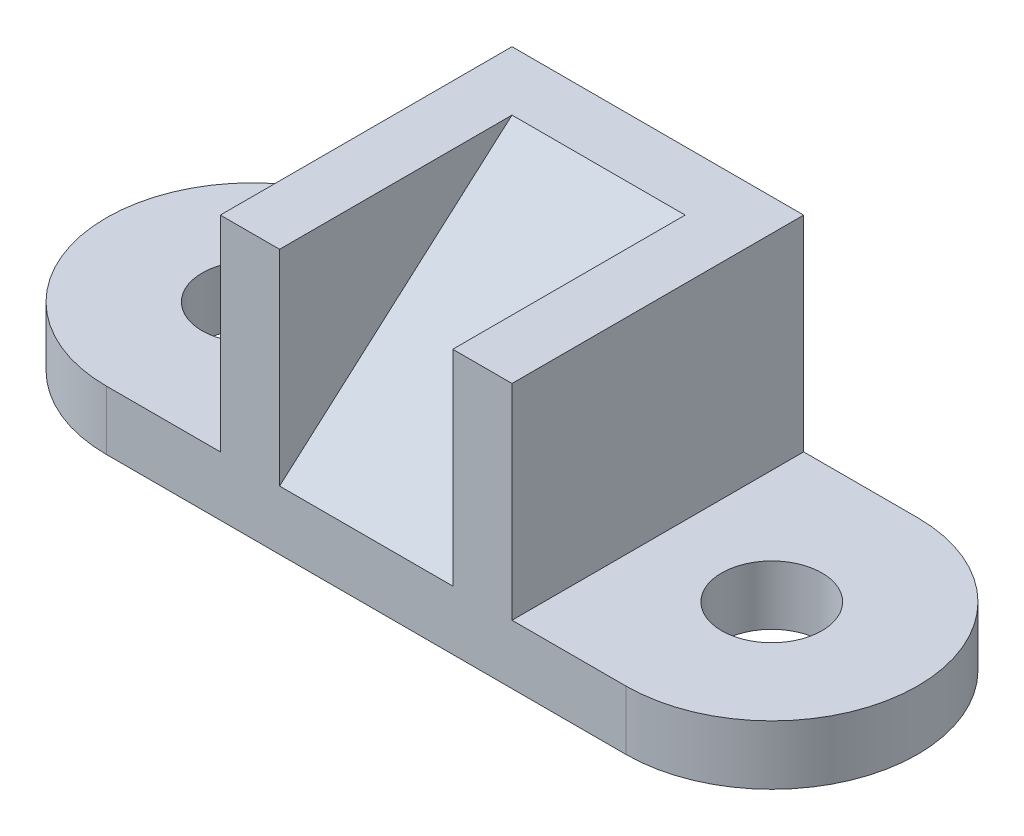
ISO-10303-21;
HEADER;
FILE_DESCRIPTION(('STEP AP214'),'2;1');
FILE_NAME('part.step','',(''),(''),'','','');
FILE_SCHEMA(('AUTOMOTIVE_DESIGN { 1 0 10303 214 1 1 1 1 }'));
ENDSEC;
DATA;
#1=APPLICATION_CONTEXT('core data for automotive mechanical design processes');
#2=APPLICATION_PROTOCOL_DEFINITION('international standard','automotive_design',2000,#1);
#3=PRODUCT_CONTEXT('',#1,'mechanical');
#4=PRODUCT('Part','Part','',(#3));
#5=PRODUCT_RELATED_PRODUCT_CATEGORY('part','',(#4));
#6=PRODUCT_DEFINITION_FORMATION('','',#4);
#7=PRODUCT_DEFINITION_CONTEXT('part definition',#1,'design');
#8=PRODUCT_DEFINITION('design','',#6,#7);
#9=PRODUCT_DEFINITION_SHAPE('','',#8);
#10=(LENGTH_UNIT() NAMED_UNIT(*) SI_UNIT(.MILLI.,.METRE.));
#11=(NAMED_UNIT(*) PLANE_ANGLE_UNIT() SI_UNIT($,.RADIAN.));
#12=(NAMED_UNIT(*) SI_UNIT($,.STERADIAN.) SOLID_ANGLE_UNIT());
#13=UNCERTAINTY_MEASURE_WITH_UNIT(LENGTH_MEASURE(1.E-05),#10,'distance_accuracy_value','');
#14=(GEOMETRIC_REPRESENTATION_CONTEXT(3) GLOBAL_UNCERTAINTY_ASSIGNED_CONTEXT((#13)) GLOBAL_UNIT_ASSIGNED_CONTEXT((#10,
#11,#12)) REPRESENTATION_CONTEXT('',''));
#15=CARTESIAN_POINT('',(0.,0.,0.));
#16=DIRECTION('',(0.,0.,1.));
#17=DIRECTION('',(1.,0.,0.));
#18=AXIS2_PLACEMENT_3D('',#15,#16,#17);
#19=CARTESIAN_POINT('',(0.,13.,0.));
#20=DIRECTION('',(0.,0.,1.));
#21=DIRECTION('',(1.,0.,0.));
#22=AXIS2_PLACEMENT_3D('',#19,#20,#21);
#23=PLANE('',#22);
#24=DIRECTION('',(0.,-1.,0.));
#25=VECTOR('',#24,1.);
#26=CARTESIAN_POINT('',(19.,58.,0.));
#27=LINE('',#26,#25);
#28=CARTESIAN_POINT('',(19.,58.,0.));
#29=VERTEX_POINT('',#28);
#30=CARTESIAN_POINT('',(19.,13.,0.));
#31=VERTEX_POINT('',#30);
#32=EDGE_CURVE('E124',#29,#31,#27,.T.);
#33=ORIENTED_EDGE('',*,*,#32,.T.);
#34=DIRECTION('',(1.,0.,0.));
#35=VECTOR('',#34,1.);
#36=CARTESIAN_POINT('',(-19.,13.,0.));
#37=LINE('',#36,#35);
#38=CARTESIAN_POINT('',(-19.,13.,0.));
#39=VERTEX_POINT('',#38);
#40=EDGE_CURVE('E183',#39,#31,#37,.T.);
#41=ORIENTED_EDGE('',*,*,#40,.F.);
#42=DIRECTION('',(0.,-1.,0.));
#43=VECTOR('',#42,1.);
#44=CARTESIAN_POINT('',(-19.,58.,0.));
#45=LINE('',#44,#43);
#46=CARTESIAN_POINT('',(-19.,58.,0.));
#47=VERTEX_POINT('',#46);
#48=EDGE_CURVE('E176',#47,#39,#45,.T.);
#49=ORIENTED_EDGE('',*,*,#48,.F.);
#50=DIRECTION('',(1.,0.,0.));
#51=VECTOR('',#50,1.);
#52=CARTESIAN_POINT('',(0.,58.,0.));
#53=LINE('',#52,#51);
#54=CARTESIAN_POINT('',(-32.,58.,0.));
#55=VERTEX_POINT('',#54);
#56=EDGE_CURVE('E191',#55,#47,#53,.T.);
#57=ORIENTED_EDGE('',*,*,#56,.F.);
#58=DIRECTION('',(0.,-1.,0.));
#59=VECTOR('',#58,1.);
#60=CARTESIAN_POINT('',(-32.,58.,0.));
#61=LINE('',#60,#59);
#62=CARTESIAN_POINT('',(-32.,13.,0.));
#63=VERTEX_POINT('',#62);
#64=EDGE_CURVE('E194',#55,#63,#61,.T.);
#65=ORIENTED_EDGE('',*,*,#64,.T.);
#66=DIRECTION('',(-1.,0.,0.));
#67=VECTOR('',#66,1.);
#68=CARTESIAN_POINT('',(0.,13.,0.));
#69=LINE('',#68,#67);
#70=CARTESIAN_POINT('',(-57.,13.,0.));
#71=VERTEX_POINT('',#70);
#72=EDGE_CURVE('E212',#63,#71,#69,.T.);
#73=ORIENTED_EDGE('',*,*,#72,.T.);
#74=DIRECTION('',(0.,-1.,0.));
#75=VECTOR('',#74,1.);
#76=CARTESIAN_POINT('',(-57.,13.,0.));
#77=LINE('',#76,#75);
#78=CARTESIAN_POINT('',(-57.,0.,0.));
#79=VERTEX_POINT('',#78);
#80=EDGE_CURVE('E11',#71,#79,#77,.T.);
#81=ORIENTED_EDGE('',*,*,#80,.T.);
#82=DIRECTION('',(-1.,0.,0.));
#83=VECTOR('',#82,1.);
#84=CARTESIAN_POINT('',(0.,0.,0.));
#85=LINE('',#84,#83);
#86=CARTESIAN_POINT('',(57.,0.,0.));
#87=VERTEX_POINT('',#86);
#88=EDGE_CURVE('E220',#87,#79,#85,.T.);
#89=ORIENTED_EDGE('',*,*,#88,.F.);
#90=DIRECTION('',(0.,-1.,0.));
#91=VECTOR('',#90,1.);
#92=CARTESIAN_POINT('',(57.,13.,0.));
#93=LINE('',#92,#91);
#94=CARTESIAN_POINT('',(57.,13.,0.));
#95=VERTEX_POINT('',#94);
#96=EDGE_CURVE('E168',#95,#87,#93,.T.);
#97=ORIENTED_EDGE('',*,*,#96,.F.);
#98=DIRECTION('',(1.,0.,0.));
#99=VECTOR('',#98,1.);
#100=CARTESIAN_POINT('',(0.,13.,0.));
#101=LINE('',#100,#99);
#102=CARTESIAN_POINT('',(32.,13.,0.));
#103=VERTEX_POINT('',#102);
#104=EDGE_CURVE('E166',#103,#95,#101,.T.);
#105=ORIENTED_EDGE('',*,*,#104,.F.);
#106=DIRECTION('',(0.,-1.,0.));
#107=VECTOR('',#106,1.);
#108=CARTESIAN_POINT('',(32.,58.,0.));
#109=LINE('',#108,#107);
#110=CARTESIAN_POINT('',(32.,58.,0.));
#111=VERTEX_POINT('',#110);
#112=EDGE_CURVE('E145',#111,#103,#109,.T.);
#113=ORIENTED_EDGE('',*,*,#112,.F.);
#114=DIRECTION('',(-1.,0.,0.));
#115=VECTOR('',#114,1.);
#116=CARTESIAN_POINT('',(0.,58.,0.));
#117=LINE('',#116,#115);
#118=EDGE_CURVE('E138',#111,#29,#117,.T.);
#119=ORIENTED_EDGE('',*,*,#118,.T.);
#120=EDGE_LOOP('',(#33,#41,#49,#57,#65,#73,#81,#89,#97,#105,#113,#119));
#121=FACE_BOUND('',#120,.T.);
#122=ADVANCED_FACE('F41',(#121),#23,.T.);
#123=CARTESIAN_POINT('',(0.,58.,0.));
#124=DIRECTION('',(0.,-1.,0.));
#125=DIRECTION('',(0.,0.,-1.));
#126=AXIS2_PLACEMENT_3D('',#123,#124,#125);
#127=PLANE('',#126);
#128=DIRECTION('',(1.,0.,0.));
#129=VECTOR('',#128,1.);
#130=CARTESIAN_POINT('',(-19.,58.,-51.));
#131=LINE('',#130,#129);
#132=CARTESIAN_POINT('',(-19.,58.,-51.));
#133=VERTEX_POINT('',#132);
#134=CARTESIAN_POINT('',(19.,58.,-51.));
#135=VERTEX_POINT('',#134);
#136=EDGE_CURVE('E142',#133,#135,#131,.T.);
#137=ORIENTED_EDGE('',*,*,#136,.T.);
#138=DIRECTION('',(0.,0.,1.));
#139=VECTOR('',#138,1.);
#140=CARTESIAN_POINT('',(19.,58.,-51.));
#141=LINE('',#140,#139);
#142=EDGE_CURVE('E127',#135,#29,#141,.T.);
#143=ORIENTED_EDGE('',*,*,#142,.T.);
#144=ORIENTED_EDGE('',*,*,#118,.F.);
#145=DIRECTION('',(0.,0.,1.));
#146=VECTOR('',#145,1.);
#147=CARTESIAN_POINT('',(32.,58.,0.));
#148=LINE('',#147,#146);
#149=CARTESIAN_POINT('',(32.,58.,-64.));
#150=VERTEX_POINT('',#149);
#151=EDGE_CURVE('E146',#150,#111,#148,.T.);
#152=ORIENTED_EDGE('',*,*,#151,.F.);
#153=DIRECTION('',(-1.,0.,0.));
#154=VECTOR('',#153,1.);
#155=CARTESIAN_POINT('',(-32.,58.,-64.));
#156=LINE('',#155,#154);
#157=CARTESIAN_POINT('',(-32.,58.,-64.));
#158=VERTEX_POINT('',#157);
#159=EDGE_CURVE('E187',#150,#158,#156,.T.);
#160=ORIENTED_EDGE('',*,*,#159,.T.);
#161=DIRECTION('',(0.,0.,1.));
#162=VECTOR('',#161,1.);
#163=CARTESIAN_POINT('',(-32.,58.,0.));
#164=LINE('',#163,#162);
#165=EDGE_CURVE('E189',#158,#55,#164,.T.);
#166=ORIENTED_EDGE('',*,*,#165,.T.);
#167=ORIENTED_EDGE('',*,*,#56,.T.);
#168=DIRECTION('',(0.,0.,1.));
#169=VECTOR('',#168,1.);
#170=CARTESIAN_POINT('',(-19.,58.,-51.));
#171=LINE('',#170,#169);
#172=EDGE_CURVE('E181',#133,#47,#171,.T.);
#173=ORIENTED_EDGE('',*,*,#172,.F.);
#174=EDGE_LOOP('',(#137,#143,#144,#152,#160,#166,#167,#173));
#175=FACE_BOUND('',#174,.T.);
#176=ADVANCED_FACE('F136',(#175),#127,.F.);
#177=CARTESIAN_POINT('',(-57.,13.,-32.));
#178=DIRECTION('',(0.,-1.,0.));
#179=DIRECTION('',(0.,0.,-1.));
#180=AXIS2_PLACEMENT_3D('',#177,#178,#179);
#181=CYLINDRICAL_SURFACE('',#180,32.);
#182=CARTESIAN_POINT('',(-57.,0.,-32.));
#183=DIRECTION('',(0.,1.,0.));
#184=DIRECTION('',(0.,0.,1.));
#185=AXIS2_PLACEMENT_3D('',#182,#183,#184);
#186=CIRCLE('',#185,32.);
#187=CARTESIAN_POINT('',(-57.,0.,-64.));
#188=VERTEX_POINT('',#187);
#189=EDGE_CURVE('E206',#188,#79,#186,.T.);
#190=ORIENTED_EDGE('',*,*,#189,.T.);
#191=ORIENTED_EDGE('',*,*,#80,.F.);
#192=CARTESIAN_POINT('',(-57.,13.,-32.));
#193=DIRECTION('',(0.,1.,0.));
#194=DIRECTION('',(0.,0.,1.));
#195=AXIS2_PLACEMENT_3D('',#192,#193,#194);
#196=CIRCLE('',#195,32.);
#197=CARTESIAN_POINT('',(-57.,13.,-64.));
#198=VERTEX_POINT('',#197);
#199=EDGE_CURVE('E209',#198,#71,#196,.T.);
#200=ORIENTED_EDGE('',*,*,#199,.F.);
#201=DIRECTION('',(0.,-1.,0.));
#202=VECTOR('',#201,1.);
#203=CARTESIAN_POINT('',(-57.,13.,-64.));
#204=LINE('',#203,#202);
#205=EDGE_CURVE('E49',#198,#188,#204,.T.);
#206=ORIENTED_EDGE('',*,*,#205,.T.);
#207=EDGE_LOOP('',(#190,#191,#200,#206));
#208=FACE_BOUND('',#207,.T.);
#209=ADVANCED_FACE('F43',(#208),#181,.T.);
#210=CARTESIAN_POINT('',(0.,13.,-64.));
#211=DIRECTION('',(0.,0.,-1.));
#212=DIRECTION('',(-1.,0.,0.));
#213=AXIS2_PLACEMENT_3D('',#210,#211,#212);
#214=PLANE('',#213);
#215=DIRECTION('',(1.,0.,0.));
#216=VECTOR('',#215,1.);
#217=CARTESIAN_POINT('',(0.,0.,-64.));
#218=LINE('',#217,#216);
#219=CARTESIAN_POINT('',(57.,0.,-64.));
#220=VERTEX_POINT('',#219);
#221=EDGE_CURVE('E213',#188,#220,#218,.T.);
#222=ORIENTED_EDGE('',*,*,#221,.F.);
#223=ORIENTED_EDGE('',*,*,#205,.F.);
#224=DIRECTION('',(1.,0.,0.));
#225=VECTOR('',#224,1.);
#226=CARTESIAN_POINT('',(0.,13.,-64.));
#227=LINE('',#226,#225);
#228=CARTESIAN_POINT('',(-32.,13.,-64.));
#229=VERTEX_POINT('',#228);
#230=EDGE_CURVE('E215',#198,#229,#227,.T.);
#231=ORIENTED_EDGE('',*,*,#230,.T.);
#232=DIRECTION('',(0.,-1.,0.));
#233=VECTOR('',#232,1.);
#234=CARTESIAN_POINT('',(-32.,58.,-64.));
#235=LINE('',#234,#233);
#236=EDGE_CURVE('E199',#158,#229,#235,.T.);
#237=ORIENTED_EDGE('',*,*,#236,.F.);
#238=ORIENTED_EDGE('',*,*,#159,.F.);
#239=DIRECTION('',(0.,-1.,0.));
#240=VECTOR('',#239,1.);
#241=CARTESIAN_POINT('',(32.,58.,-64.));
#242=LINE('',#241,#240);
#243=CARTESIAN_POINT('',(32.,13.,-64.));
#244=VERTEX_POINT('',#243);
#245=EDGE_CURVE('E148',#150,#244,#242,.T.);
#246=ORIENTED_EDGE('',*,*,#245,.T.);
#247=DIRECTION('',(-1.,0.,0.));
#248=VECTOR('',#247,1.);
#249=CARTESIAN_POINT('',(0.,13.,-64.));
#250=LINE('',#249,#248);
#251=CARTESIAN_POINT('',(57.,13.,-64.));
#252=VERTEX_POINT('',#251);
#253=EDGE_CURVE('E61',#252,#244,#250,.T.);
#254=ORIENTED_EDGE('',*,*,#253,.F.);
#255=DIRECTION('',(0.,-1.,0.));
#256=VECTOR('',#255,1.);
#257=CARTESIAN_POINT('',(57.,13.,-64.));
#258=LINE('',#257,#256);
#259=EDGE_CURVE('E173',#252,#220,#258,.T.);
#260=ORIENTED_EDGE('',*,*,#259,.T.);
#261=EDGE_LOOP('',(#222,#223,#231,#237,#238,#246,#254,#260));
#262=FACE_BOUND('',#261,.T.);
#263=ADVANCED_FACE('F232',(#262),#214,.T.);
#264=CARTESIAN_POINT('',(0.,13.,0.));
#265=DIRECTION('',(0.,1.,0.));
#266=DIRECTION('',(0.,0.,1.));
#267=AXIS2_PLACEMENT_3D('',#264,#265,#266);
#268=PLANE('',#267);
#269=DIRECTION('',(0.,0.,1.));
#270=VECTOR('',#269,1.);
#271=CARTESIAN_POINT('',(-32.,13.,0.));
#272=LINE('',#271,#270);
#273=EDGE_CURVE('E185',#229,#63,#272,.T.);
#274=ORIENTED_EDGE('',*,*,#273,.F.);
#275=ORIENTED_EDGE('',*,*,#230,.F.);
#276=ORIENTED_EDGE('',*,*,#199,.T.);
#277=ORIENTED_EDGE('',*,*,#72,.F.);
#278=EDGE_LOOP('',(#274,#275,#276,#277));
#279=FACE_BOUND('',#278,.T.);
#280=CARTESIAN_POINT('',(-57.,13.,-32.));
#281=DIRECTION('',(0.,1.,0.));
#282=DIRECTION('',(0.,0.,1.));
#283=AXIS2_PLACEMENT_3D('',#280,#281,#282);
#284=CIRCLE('',#283,11.);
#285=CARTESIAN_POINT('',(-57.,13.,-21.));
#286=VERTEX_POINT('',#285);
#287=EDGE_CURVE('E202',#286,#286,#284,.T.);
#288=ORIENTED_EDGE('',*,*,#287,.F.);
#289=EDGE_LOOP('',(#288));
#290=FACE_BOUND('',#289,.T.);
#291=ADVANCED_FACE('F240',(#279,#290),#268,.T.);
#292=CARTESIAN_POINT('',(0.,0.,0.));
#293=DIRECTION('',(0.,1.,0.));
#294=DIRECTION('',(0.,0.,1.));
#295=AXIS2_PLACEMENT_3D('',#292,#293,#294);
#296=PLANE('',#295);
#297=CARTESIAN_POINT('',(57.,0.,-32.));
#298=DIRECTION('',(0.,-1.,0.));
#299=DIRECTION('',(0.,0.,1.));
#300=AXIS2_PLACEMENT_3D('',#297,#298,#299);
#301=CIRCLE('',#300,11.);
#302=CARTESIAN_POINT('',(57.,0.,-21.));
#303=VERTEX_POINT('',#302);
#304=EDGE_CURVE('E156',#303,#303,#301,.T.);
#305=ORIENTED_EDGE('',*,*,#304,.F.);
#306=EDGE_LOOP('',(#305));
#307=FACE_BOUND('',#306,.T.);
#308=CARTESIAN_POINT('',(-57.,0.,-32.));
#309=DIRECTION('',(0.,1.,0.));
#310=DIRECTION('',(0.,0.,1.));
#311=AXIS2_PLACEMENT_3D('',#308,#309,#310);
#312=CIRCLE('',#311,11.);
#313=CARTESIAN_POINT('',(-57.,0.,-21.));
#314=VERTEX_POINT('',#313);
#315=EDGE_CURVE('E203',#314,#314,#312,.T.);
#316=ORIENTED_EDGE('',*,*,#315,.T.);
#317=EDGE_LOOP('',(#316));
#318=FACE_BOUND('',#317,.T.);
#319=ORIENTED_EDGE('',*,*,#189,.F.);
#320=ORIENTED_EDGE('',*,*,#221,.T.);
#321=CARTESIAN_POINT('',(57.,0.,-32.));
#322=DIRECTION('',(0.,-1.,0.));
#323=DIRECTION('',(0.,0.,1.));
#324=AXIS2_PLACEMENT_3D('',#321,#322,#323);
#325=CIRCLE('',#324,32.);
#326=EDGE_CURVE('E159',#220,#87,#325,.T.);
#327=ORIENTED_EDGE('',*,*,#326,.T.);
#328=ORIENTED_EDGE('',*,*,#88,.T.);
#329=EDGE_LOOP('',(#319,#320,#327,#328));
#330=FACE_BOUND('',#329,.T.);
#331=ADVANCED_FACE('F231',(#307,#318,#330),#296,.F.);
#332=CARTESIAN_POINT('',(-57.,0.,-32.));
#333=DIRECTION('',(0.,1.,0.));
#334=DIRECTION('',(0.,0.,1.));
#335=AXIS2_PLACEMENT_3D('',#332,#333,#334);
#336=CYLINDRICAL_SURFACE('',#335,11.);
#337=CARTESIAN_POINT('',(-57.,0.,-21.));
#338=CARTESIAN_POINT('',(-57.,0.135416666666666,-21.));
#339=CARTESIAN_POINT('',(-57.,0.270833333333333,-21.));
#340=CARTESIAN_POINT('',(-57.,0.541666666666667,-21.));
#341=CARTESIAN_POINT('',(-57.,0.677083333333333,-21.));
#342=CARTESIAN_POINT('',(-57.,0.947916666666667,-21.));
#343=CARTESIAN_POINT('',(-57.,1.08333333333333,-21.));
#344=CARTESIAN_POINT('',(-57.,1.35416666666667,-21.));
#345=CARTESIAN_POINT('',(-57.,1.48958333333333,-21.));
#346=CARTESIAN_POINT('',(-57.,1.76041666666667,-21.));
#347=CARTESIAN_POINT('',(-57.,1.89583333333333,-21.));
#348=CARTESIAN_POINT('',(-57.,2.16666666666667,-21.));
#349=CARTESIAN_POINT('',(-57.,2.30208333333333,-21.));
#350=CARTESIAN_POINT('',(-57.,2.57291666666667,-21.));
#351=CARTESIAN_POINT('',(-57.,2.70833333333333,-21.));
#352=CARTESIAN_POINT('',(-57.,2.97916666666667,-21.));
#353=CARTESIAN_POINT('',(-57.,3.11458333333333,-21.));
#354=CARTESIAN_POINT('',(-57.,3.38541666666667,-21.));
#355=CARTESIAN_POINT('',(-57.,3.52083333333333,-21.));
#356=CARTESIAN_POINT('',(-57.,3.79166666666667,-21.));
#357=CARTESIAN_POINT('',(-57.,3.92708333333333,-21.));
#358=CARTESIAN_POINT('',(-57.,4.19791666666667,-21.));
#359=CARTESIAN_POINT('',(-57.,4.33333333333333,-21.));
#360=CARTESIAN_POINT('',(-57.,4.60416666666667,-21.));
#361=CARTESIAN_POINT('',(-57.,4.73958333333333,-21.));
#362=CARTESIAN_POINT('',(-57.,5.01041666666667,-21.));
#363=CARTESIAN_POINT('',(-57.,5.14583333333333,-21.));
#364=CARTESIAN_POINT('',(-57.,5.41666666666667,-21.));
#365=CARTESIAN_POINT('',(-57.,5.55208333333333,-21.));
#366=CARTESIAN_POINT('',(-57.,5.82291666666667,-21.));
#367=CARTESIAN_POINT('',(-57.,5.95833333333333,-21.));
#368=CARTESIAN_POINT('',(-57.,6.22916666666667,-21.));
#369=CARTESIAN_POINT('',(-57.,6.36458333333333,-21.));
#370=CARTESIAN_POINT('',(-57.,6.63541666666667,-21.));
#371=CARTESIAN_POINT('',(-57.,6.77083333333333,-21.));
#372=CARTESIAN_POINT('',(-57.,7.04166666666667,-21.));
#373=CARTESIAN_POINT('',(-57.,7.17708333333333,-21.));
#374=CARTESIAN_POINT('',(-57.,7.44791666666667,-21.));
#375=CARTESIAN_POINT('',(-57.,7.58333333333333,-21.));
#376=CARTESIAN_POINT('',(-57.,7.85416666666667,-21.));
#377=CARTESIAN_POINT('',(-57.,7.98958333333333,-21.));
#378=CARTESIAN_POINT('',(-57.,8.26041666666667,-21.));
#379=CARTESIAN_POINT('',(-57.,8.39583333333333,-21.));
#380=CARTESIAN_POINT('',(-57.,8.66666666666667,-21.));
#381=CARTESIAN_POINT('',(-57.,8.80208333333333,-21.));
#382=CARTESIAN_POINT('',(-57.,9.07291666666667,-21.));
#383=CARTESIAN_POINT('',(-57.,9.20833333333333,-21.));
#384=CARTESIAN_POINT('',(-57.,9.47916666666667,-21.));
#385=CARTESIAN_POINT('',(-57.,9.61458333333333,-21.));
#386=CARTESIAN_POINT('',(-57.,9.88541666666667,-21.));
#387=CARTESIAN_POINT('',(-57.,10.0208333333333,-21.));
#388=CARTESIAN_POINT('',(-57.,10.2916666666667,-21.));
#389=CARTESIAN_POINT('',(-57.,10.4270833333333,-21.));
#390=CARTESIAN_POINT('',(-57.,10.6979166666667,-21.));
#391=CARTESIAN_POINT('',(-57.,10.8333333333333,-21.));
#392=CARTESIAN_POINT('',(-57.,11.1041666666667,-21.));
#393=CARTESIAN_POINT('',(-57.,11.2395833333333,-21.));
#394=CARTESIAN_POINT('',(-57.,11.5104166666667,-21.));
#395=CARTESIAN_POINT('',(-57.,11.6458333333333,-21.));
#396=CARTESIAN_POINT('',(-57.,11.9166666666667,-21.));
#397=CARTESIAN_POINT('',(-57.,12.0520833333333,-21.));
#398=CARTESIAN_POINT('',(-57.,12.3229166666667,-21.));
#399=CARTESIAN_POINT('',(-57.,12.4583333333333,-21.));
#400=CARTESIAN_POINT('',(-57.,12.7291666666667,-21.));
#401=CARTESIAN_POINT('',(-57.,12.8645833333333,-21.));
#402=CARTESIAN_POINT('',(-57.,13.,-21.));
#403=B_SPLINE_CURVE_WITH_KNOTS('',3,(#337,#338,#339,#340,#341,#342,#343,#344,#345,#346,#347,
#348,#349,#350,#351,#352,#353,#354,#355,#356,#357,#358,#359,#360,#361,#362,#363,#364,#365,#366,
#367,#368,#369,#370,#371,#372,#373,#374,#375,#376,#377,#378,#379,#380,#381,#382,#383,#384,#385,
#386,#387,#388,#389,#390,#391,#392,#393,#394,#395,#396,#397,#398,#399,#400,#401,#402),
.UNSPECIFIED.,.F.,.F.,(4,2,2,2,2,2,2,2,2,2,2,2,2,2,2,2,2,2,2,2,2,2,2,2,2,2,2,2,2,2,2,2,4),(0.,
0.40625,0.8125,1.21875,1.625,2.03125,2.4375,2.84375,3.25,3.65625,4.0625,4.46875,4.875,5.28125,
5.6875,6.09375,6.5,6.90625,7.3125,7.71875,8.125,8.53125,8.9375,9.34375,9.75,10.15625,10.5625,
10.96875,11.375,11.78125,12.1875,12.59375,13.),.UNSPECIFIED.);
#404=EDGE_CURVE('BSEAM270',#314,#286,#403,.T.);
#405=ORIENTED_EDGE('',*,*,#315,.F.);
#406=ORIENTED_EDGE('',*,*,#287,.T.);
#407=ORIENTED_EDGE('',*,*,#404,.T.);
#408=ORIENTED_EDGE('',*,*,#404,.F.);
#409=EDGE_LOOP('',(#405,#407,#406,#408));
#410=FACE_BOUND('',#409,.T.);
#411=ADVANCED_FACE('F270',(#410),#336,.F.);
#412=CARTESIAN_POINT('',(-32.,58.,0.));
#413=DIRECTION('',(1.,0.,0.));
#414=DIRECTION('',(0.,0.,-1.));
#415=AXIS2_PLACEMENT_3D('',#412,#413,#414);
#416=PLANE('',#415);
#417=ORIENTED_EDGE('',*,*,#273,.T.);
#418=ORIENTED_EDGE('',*,*,#64,.F.);
#419=ORIENTED_EDGE('',*,*,#165,.F.);
#420=ORIENTED_EDGE('',*,*,#236,.T.);
#421=EDGE_LOOP('',(#417,#418,#419,#420));
#422=FACE_BOUND('',#421,.T.);
#423=ADVANCED_FACE('F245',(#422),#416,.F.);
#424=CARTESIAN_POINT('',(-19.,13.,0.));
#425=DIRECTION('',(0.,-0.749837855365093,-0.661621637086846));
#426=DIRECTION('',(0.,0.661621637086846,-0.749837855365093));
#427=AXIS2_PLACEMENT_3D('',#424,#425,#426);
#428=PLANE('',#427);
#429=ORIENTED_EDGE('',*,*,#40,.T.);
#430=DIRECTION('',(0.,0.661621637086846,-0.749837855365093));
#431=VECTOR('',#430,1.);
#432=CARTESIAN_POINT('',(19.,13.,0.));
#433=LINE('',#432,#431);
#434=EDGE_CURVE('E129',#31,#135,#433,.T.);
#435=ORIENTED_EDGE('',*,*,#434,.T.);
#436=ORIENTED_EDGE('',*,*,#136,.F.);
#437=DIRECTION('',(0.,0.661621637086846,-0.749837855365093));
#438=VECTOR('',#437,1.);
#439=CARTESIAN_POINT('',(-19.,13.,0.));
#440=LINE('',#439,#438);
#441=EDGE_CURVE('E179',#39,#133,#440,.T.);
#442=ORIENTED_EDGE('',*,*,#441,.F.);
#443=EDGE_LOOP('',(#429,#435,#436,#442));
#444=FACE_BOUND('',#443,.T.);
#445=ADVANCED_FACE('F278',(#444),#428,.F.);
#446=CARTESIAN_POINT('',(-19.,0.,0.));
#447=DIRECTION('',(-1.,0.,0.));
#448=DIRECTION('',(0.,0.,1.));
#449=AXIS2_PLACEMENT_3D('',#446,#447,#448);
#450=PLANE('',#449);
#451=ORIENTED_EDGE('',*,*,#48,.T.);
#452=ORIENTED_EDGE('',*,*,#441,.T.);
#453=ORIENTED_EDGE('',*,*,#172,.T.);
#454=EDGE_LOOP('',(#451,#452,#453));
#455=FACE_BOUND('',#454,.T.);
#456=ADVANCED_FACE('F282',(#455),#450,.F.);
#457=CARTESIAN_POINT('',(57.,13.,-32.));
#458=DIRECTION('',(0.,-1.,0.));
#459=DIRECTION('',(0.,0.,-1.));
#460=AXIS2_PLACEMENT_3D('',#457,#458,#459);
#461=CYLINDRICAL_SURFACE('',#460,32.);
#462=ORIENTED_EDGE('',*,*,#326,.F.);
#463=ORIENTED_EDGE('',*,*,#259,.F.);
#464=CARTESIAN_POINT('',(57.,13.,-32.));
#465=DIRECTION('',(0.,-1.,0.));
#466=DIRECTION('',(0.,0.,1.));
#467=AXIS2_PLACEMENT_3D('',#464,#465,#466);
#468=CIRCLE('',#467,32.);
#469=EDGE_CURVE('E162',#252,#95,#468,.T.);
#470=ORIENTED_EDGE('',*,*,#469,.T.);
#471=ORIENTED_EDGE('',*,*,#96,.T.);
#472=EDGE_LOOP('',(#462,#463,#470,#471));
#473=FACE_BOUND('',#472,.T.);
#474=ADVANCED_FACE('F235',(#473),#461,.T.);
#475=CARTESIAN_POINT('',(0.,13.,0.));
#476=DIRECTION('',(0.,1.,0.));
#477=DIRECTION('',(0.,0.,1.));
#478=AXIS2_PLACEMENT_3D('',#475,#476,#477);
#479=PLANE('',#478);
#480=DIRECTION('',(0.,0.,1.));
#481=VECTOR('',#480,1.);
#482=CARTESIAN_POINT('',(32.,13.,0.));
#483=LINE('',#482,#481);
#484=EDGE_CURVE('E56',#244,#103,#483,.T.);
#485=ORIENTED_EDGE('',*,*,#484,.T.);
#486=ORIENTED_EDGE('',*,*,#104,.T.);
#487=ORIENTED_EDGE('',*,*,#469,.F.);
#488=ORIENTED_EDGE('',*,*,#253,.T.);
#489=EDGE_LOOP('',(#485,#486,#487,#488));
#490=FACE_BOUND('',#489,.T.);
#491=CARTESIAN_POINT('',(57.,13.,-32.));
#492=DIRECTION('',(0.,-1.,0.));
#493=DIRECTION('',(0.,0.,1.));
#494=AXIS2_PLACEMENT_3D('',#491,#492,#493);
#495=CIRCLE('',#494,11.);
#496=CARTESIAN_POINT('',(57.,13.,-21.));
#497=VERTEX_POINT('',#496);
#498=EDGE_CURVE('E155',#497,#497,#495,.T.);
#499=ORIENTED_EDGE('',*,*,#498,.T.);
#500=EDGE_LOOP('',(#499));
#501=FACE_BOUND('',#500,.T.);
#502=ADVANCED_FACE('F257',(#490,#501),#479,.T.);
#503=CARTESIAN_POINT('',(57.,0.,-32.));
#504=DIRECTION('',(0.,1.,0.));
#505=DIRECTION('',(0.,0.,1.));
#506=AXIS2_PLACEMENT_3D('',#503,#504,#505);
#507=CYLINDRICAL_SURFACE('',#506,11.);
#508=CARTESIAN_POINT('',(57.,0.,-21.));
#509=CARTESIAN_POINT('',(57.,0.135416666666666,-21.));
#510=CARTESIAN_POINT('',(57.,0.270833333333333,-21.));
#511=CARTESIAN_POINT('',(57.,0.541666666666667,-21.));
#512=CARTESIAN_POINT('',(57.,0.677083333333333,-21.));
#513=CARTESIAN_POINT('',(57.,0.947916666666667,-21.));
#514=CARTESIAN_POINT('',(57.,1.08333333333333,-21.));
#515=CARTESIAN_POINT('',(57.,1.35416666666667,-21.));
#516=CARTESIAN_POINT('',(57.,1.48958333333333,-21.));
#517=CARTESIAN_POINT('',(57.,1.76041666666667,-21.));
#518=CARTESIAN_POINT('',(57.,1.89583333333333,-21.));
#519=CARTESIAN_POINT('',(57.,2.16666666666667,-21.));
#520=CARTESIAN_POINT('',(57.,2.30208333333333,-21.));
#521=CARTESIAN_POINT('',(57.,2.57291666666667,-21.));
#522=CARTESIAN_POINT('',(57.,2.70833333333333,-21.));
#523=CARTESIAN_POINT('',(57.,2.97916666666667,-21.));
#524=CARTESIAN_POINT('',(57.,3.11458333333333,-21.));
#525=CARTESIAN_POINT('',(57.,3.38541666666667,-21.));
#526=CARTESIAN_POINT('',(57.,3.52083333333333,-21.));
#527=CARTESIAN_POINT('',(57.,3.79166666666667,-21.));
#528=CARTESIAN_POINT('',(57.,3.92708333333333,-21.));
#529=CARTESIAN_POINT('',(57.,4.19791666666667,-21.));
#530=CARTESIAN_POINT('',(57.,4.33333333333333,-21.));
#531=CARTESIAN_POINT('',(57.,4.60416666666667,-21.));
#532=CARTESIAN_POINT('',(57.,4.73958333333333,-21.));
#533=CARTESIAN_POINT('',(57.,5.01041666666667,-21.));
#534=CARTESIAN_POINT('',(57.,5.14583333333333,-21.));
#535=CARTESIAN_POINT('',(57.,5.41666666666667,-21.));
#536=CARTESIAN_POINT('',(57.,5.55208333333333,-21.));
#537=CARTESIAN_POINT('',(57.,5.82291666666667,-21.));
#538=CARTESIAN_POINT('',(57.,5.95833333333333,-21.));
#539=CARTESIAN_POINT('',(57.,6.22916666666667,-21.));
#540=CARTESIAN_POINT('',(57.,6.36458333333333,-21.));
#541=CARTESIAN_POINT('',(57.,6.63541666666667,-21.));
#542=CARTESIAN_POINT('',(57.,6.77083333333333,-21.));
#543=CARTESIAN_POINT('',(57.,7.04166666666667,-21.));
#544=CARTESIAN_POINT('',(57.,7.17708333333333,-21.));
#545=CARTESIAN_POINT('',(57.,7.44791666666667,-21.));
#546=CARTESIAN_POINT('',(57.,7.58333333333333,-21.));
#547=CARTESIAN_POINT('',(57.,7.85416666666667,-21.));
#548=CARTESIAN_POINT('',(57.,7.98958333333333,-21.));
#549=CARTESIAN_POINT('',(57.,8.26041666666667,-21.));
#550=CARTESIAN_POINT('',(57.,8.39583333333333,-21.));
#551=CARTESIAN_POINT('',(57.,8.66666666666667,-21.));
#552=CARTESIAN_POINT('',(57.,8.80208333333333,-21.));
#553=CARTESIAN_POINT('',(57.,9.07291666666667,-21.));
#554=CARTESIAN_POINT('',(57.,9.20833333333333,-21.));
#555=CARTESIAN_POINT('',(57.,9.47916666666667,-21.));
#556=CARTESIAN_POINT('',(57.,9.61458333333333,-21.));
#557=CARTESIAN_POINT('',(57.,9.88541666666667,-21.));
#558=CARTESIAN_POINT('',(57.,10.0208333333333,-21.));
#559=CARTESIAN_POINT('',(57.,10.2916666666667,-21.));
#560=CARTESIAN_POINT('',(57.,10.4270833333333,-21.));
#561=CARTESIAN_POINT('',(57.,10.6979166666667,-21.));
#562=CARTESIAN_POINT('',(57.,10.8333333333333,-21.));
#563=CARTESIAN_POINT('',(57.,11.1041666666667,-21.));
#564=CARTESIAN_POINT('',(57.,11.2395833333333,-21.));
#565=CARTESIAN_POINT('',(57.,11.5104166666667,-21.));
#566=CARTESIAN_POINT('',(57.,11.6458333333333,-21.));
#567=CARTESIAN_POINT('',(57.,11.9166666666667,-21.));
#568=CARTESIAN_POINT('',(57.,12.0520833333333,-21.));
#569=CARTESIAN_POINT('',(57.,12.3229166666667,-21.));
#570=CARTESIAN_POINT('',(57.,12.4583333333333,-21.));
#571=CARTESIAN_POINT('',(57.,12.7291666666667,-21.));
#572=CARTESIAN_POINT('',(57.,12.8645833333333,-21.));
#573=CARTESIAN_POINT('',(57.,13.,-21.));
#574=B_SPLINE_CURVE_WITH_KNOTS('',3,(#508,#509,#510,#511,#512,#513,#514,#515,#516,#517,#518,
#519,#520,#521,#522,#523,#524,#525,#526,#527,#528,#529,#530,#531,#532,#533,#534,#535,#536,#537,
#538,#539,#540,#541,#542,#543,#544,#545,#546,#547,#548,#549,#550,#551,#552,#553,#554,#555,#556,
#557,#558,#559,#560,#561,#562,#563,#564,#565,#566,#567,#568,#569,#570,#571,#572,#573),
.UNSPECIFIED.,.F.,.F.,(4,2,2,2,2,2,2,2,2,2,2,2,2,2,2,2,2,2,2,2,2,2,2,2,2,2,2,2,2,2,2,2,4),(0.,
0.40625,0.8125,1.21875,1.625,2.03125,2.4375,2.84375,3.25,3.65625,4.0625,4.46875,4.875,5.28125,
5.6875,6.09375,6.5,6.90625,7.3125,7.71875,8.125,8.53125,8.9375,9.34375,9.75,10.15625,10.5625,
10.96875,11.375,11.78125,12.1875,12.59375,13.),.UNSPECIFIED.);
#575=EDGE_CURVE('BSEAM250',#303,#497,#574,.T.);
#576=ORIENTED_EDGE('',*,*,#304,.T.);
#577=ORIENTED_EDGE('',*,*,#498,.F.);
#578=ORIENTED_EDGE('',*,*,#575,.T.);
#579=ORIENTED_EDGE('',*,*,#575,.F.);
#580=EDGE_LOOP('',(#576,#578,#577,#579));
#581=FACE_BOUND('',#580,.T.);
#582=ADVANCED_FACE('F250',(#581),#507,.F.);
#583=CARTESIAN_POINT('',(32.,58.,0.));
#584=DIRECTION('',(1.,0.,0.));
#585=DIRECTION('',(0.,0.,-1.));
#586=AXIS2_PLACEMENT_3D('',#583,#584,#585);
#587=PLANE('',#586);
#588=ORIENTED_EDGE('',*,*,#484,.F.);
#589=ORIENTED_EDGE('',*,*,#245,.F.);
#590=ORIENTED_EDGE('',*,*,#151,.T.);
#591=ORIENTED_EDGE('',*,*,#112,.T.);
#592=EDGE_LOOP('',(#588,#589,#590,#591));
#593=FACE_BOUND('',#592,.T.);
#594=ADVANCED_FACE('F248',(#593),#587,.T.);
#595=CARTESIAN_POINT('',(19.,0.,0.));
#596=DIRECTION('',(1.,0.,0.));
#597=DIRECTION('',(0.,0.,1.));
#598=AXIS2_PLACEMENT_3D('',#595,#596,#597);
#599=PLANE('',#598);
#600=ORIENTED_EDGE('',*,*,#32,.F.);
#601=ORIENTED_EDGE('',*,*,#142,.F.);
#602=ORIENTED_EDGE('',*,*,#434,.F.);
#603=EDGE_LOOP('',(#600,#601,#602));
#604=FACE_BOUND('',#603,.T.);
#605=ADVANCED_FACE('F126',(#604),#599,.F.);
#606=CLOSED_SHELL('',(#122,#176,#209,#263,#291,#331,#411,#423,#445,#456,#474,#502,#582,#594,#605));
#607=MANIFOLD_SOLID_BREP('B2',#606);
#608=ADVANCED_BREP_SHAPE_REPRESENTATION('',(#18,#607),#14);
#609=SHAPE_DEFINITION_REPRESENTATION(#9,#608);
ENDSEC;
END-ISO-10303-21;
